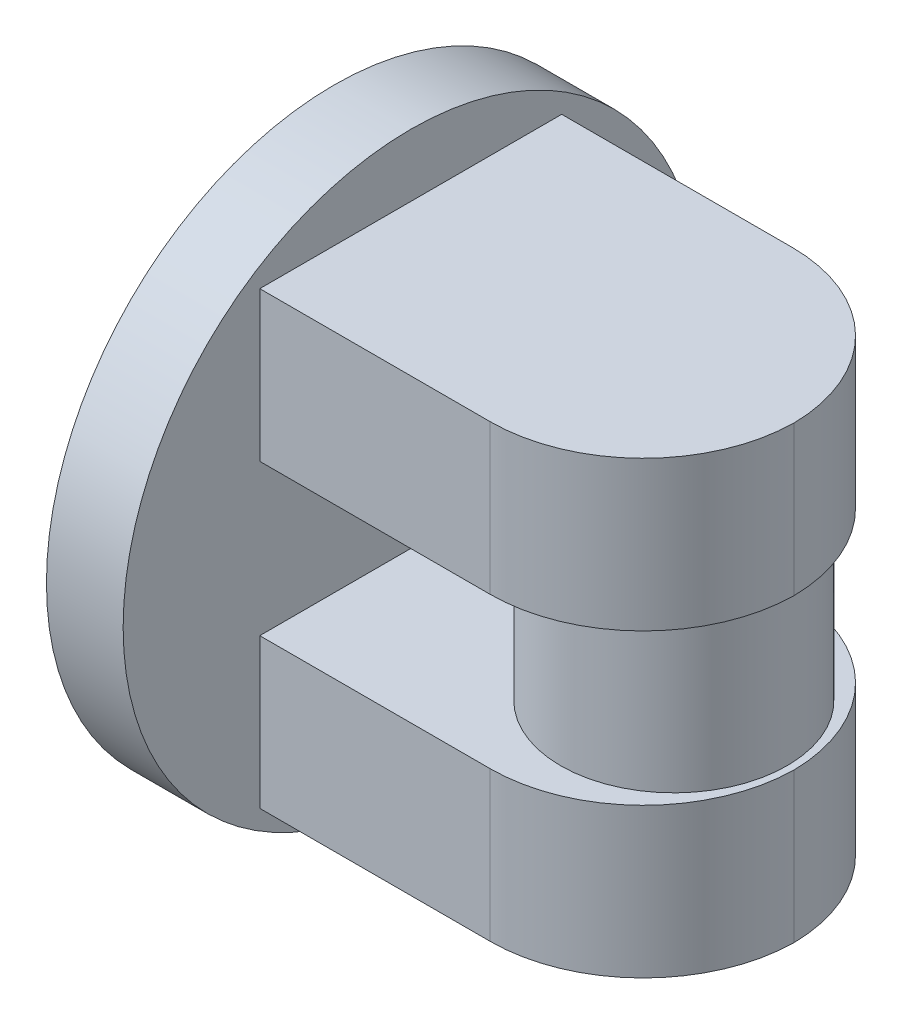
ISO-10303-21;
HEADER;
FILE_DESCRIPTION(('STEP AP214'),'2;1');
FILE_NAME('part.step','',(''),(''),'','','');
FILE_SCHEMA(('AUTOMOTIVE_DESIGN { 1 0 10303 214 1 1 1 1 }'));
ENDSEC;
DATA;
#1=APPLICATION_CONTEXT('core data for automotive mechanical design processes');
#2=APPLICATION_PROTOCOL_DEFINITION('international standard','automotive_design',2000,#1);
#3=PRODUCT_CONTEXT('',#1,'mechanical');
#4=PRODUCT('Part','Part','',(#3));
#5=PRODUCT_RELATED_PRODUCT_CATEGORY('part','',(#4));
#6=PRODUCT_DEFINITION_FORMATION('','',#4);
#7=PRODUCT_DEFINITION_CONTEXT('part definition',#1,'design');
#8=PRODUCT_DEFINITION('design','',#6,#7);
#9=PRODUCT_DEFINITION_SHAPE('','',#8);
#10=(LENGTH_UNIT() NAMED_UNIT(*) SI_UNIT(.MILLI.,.METRE.));
#11=(NAMED_UNIT(*) PLANE_ANGLE_UNIT() SI_UNIT($,.RADIAN.));
#12=(NAMED_UNIT(*) SI_UNIT($,.STERADIAN.) SOLID_ANGLE_UNIT());
#13=UNCERTAINTY_MEASURE_WITH_UNIT(LENGTH_MEASURE(1.E-05),#10,'distance_accuracy_value','');
#14=(GEOMETRIC_REPRESENTATION_CONTEXT(3) GLOBAL_UNCERTAINTY_ASSIGNED_CONTEXT((#13)) GLOBAL_UNIT_ASSIGNED_CONTEXT((#10,
#11,#12)) REPRESENTATION_CONTEXT('',''));
#15=CARTESIAN_POINT('',(0.,0.,0.));
#16=DIRECTION('',(0.,0.,1.));
#17=DIRECTION('',(1.,0.,0.));
#18=AXIS2_PLACEMENT_3D('',#15,#16,#17);
#19=CARTESIAN_POINT('',(202.565,159.836148569031,-4.53847309349857));
#20=DIRECTION('',(1.,0.,0.));
#21=DIRECTION('',(0.,0.,-1.));
#22=AXIS2_PLACEMENT_3D('',#19,#20,#21);
#23=PLANE('',#22);
#24=DIRECTION('',(0.,-1.,0.));
#25=VECTOR('',#24,1.);
#26=CARTESIAN_POINT('',(202.565,0.,-14.5384730934986));
#27=LINE('',#26,#25);
#28=CARTESIAN_POINT('',(202.565,154.836148569031,-14.5384730934986));
#29=VERTEX_POINT('',#28);
#30=CARTESIAN_POINT('',(202.565,144.930148569031,-14.5384730934986));
#31=VERTEX_POINT('',#30);
#32=EDGE_CURVE('E171',#29,#31,#27,.T.);
#33=ORIENTED_EDGE('',*,*,#32,.T.);
#34=DIRECTION('',(0.,0.,-1.));
#35=VECTOR('',#34,1.);
#36=CARTESIAN_POINT('',(202.565,144.930148569031,0.));
#37=LINE('',#36,#35);
#38=CARTESIAN_POINT('',(202.565,144.930148569031,5.46152690650143));
#39=VERTEX_POINT('',#38);
#40=EDGE_CURVE('E184',#39,#31,#37,.T.);
#41=ORIENTED_EDGE('',*,*,#40,.F.);
#42=DIRECTION('',(0.,-1.,0.));
#43=VECTOR('',#42,1.);
#44=CARTESIAN_POINT('',(202.565,0.,5.46152690650141));
#45=LINE('',#44,#43);
#46=CARTESIAN_POINT('',(202.565,154.836148569031,5.46152690650143));
#47=VERTEX_POINT('',#46);
#48=EDGE_CURVE('E180',#47,#39,#45,.T.);
#49=ORIENTED_EDGE('',*,*,#48,.F.);
#50=DIRECTION('',(0.,0.,-1.));
#51=VECTOR('',#50,1.);
#52=CARTESIAN_POINT('',(202.565,154.836148569031,0.));
#53=LINE('',#52,#51);
#54=EDGE_CURVE('E175',#47,#29,#53,.T.);
#55=ORIENTED_EDGE('',*,*,#54,.T.);
#56=EDGE_LOOP('',(#33,#41,#49,#55));
#57=FACE_BOUND('',#56,.T.);
#58=CARTESIAN_POINT('',(202.565,159.836148569031,-4.53847309349857));
#59=DIRECTION('',(1.,0.,0.));
#60=DIRECTION('',(0.,0.,-1.));
#61=AXIS2_PLACEMENT_3D('',#58,#59,#60);
#62=CIRCLE('',#61,19.05);
#63=CARTESIAN_POINT('',(202.565,159.836148569031,-23.5884730934986));
#64=VERTEX_POINT('',#63);
#65=EDGE_CURVE('E199',#64,#64,#62,.T.);
#66=ORIENTED_EDGE('',*,*,#65,.T.);
#67=EDGE_LOOP('',(#66));
#68=FACE_BOUND('',#67,.T.);
#69=DIRECTION('',(0.,1.,0.));
#70=VECTOR('',#69,1.);
#71=CARTESIAN_POINT('',(202.565,0.,-14.5384730934986));
#72=LINE('',#71,#70);
#73=CARTESIAN_POINT('',(202.565,164.836148569031,-14.5384730934986));
#74=VERTEX_POINT('',#73);
#75=CARTESIAN_POINT('',(202.565,174.742148569031,-14.5384730934986));
#76=VERTEX_POINT('',#75);
#77=EDGE_CURVE('E149',#74,#76,#72,.T.);
#78=ORIENTED_EDGE('',*,*,#77,.F.);
#79=DIRECTION('',(0.,0.,-1.));
#80=VECTOR('',#79,1.);
#81=CARTESIAN_POINT('',(202.565,164.836148569031,0.));
#82=LINE('',#81,#80);
#83=CARTESIAN_POINT('',(202.565,164.836148569031,5.46152690650143));
#84=VERTEX_POINT('',#83);
#85=EDGE_CURVE('E132',#84,#74,#82,.T.);
#86=ORIENTED_EDGE('',*,*,#85,.F.);
#87=DIRECTION('',(0.,1.,0.));
#88=VECTOR('',#87,1.);
#89=CARTESIAN_POINT('',(202.565,0.,5.46152690650143));
#90=LINE('',#89,#88);
#91=CARTESIAN_POINT('',(202.565,174.742148569031,5.46152690650143));
#92=VERTEX_POINT('',#91);
#93=EDGE_CURVE('E141',#84,#92,#90,.T.);
#94=ORIENTED_EDGE('',*,*,#93,.T.);
#95=DIRECTION('',(0.,0.,-1.));
#96=VECTOR('',#95,1.);
#97=CARTESIAN_POINT('',(202.565,174.742148569031,0.));
#98=LINE('',#97,#96);
#99=EDGE_CURVE('E156',#92,#76,#98,.T.);
#100=ORIENTED_EDGE('',*,*,#99,.T.);
#101=EDGE_LOOP('',(#78,#86,#94,#100));
#102=FACE_BOUND('',#101,.T.);
#103=ADVANCED_FACE('F51',(#57,#68,#102),#23,.T.);
#104=CARTESIAN_POINT('',(202.565,159.836148569031,-4.53847309349857));
#105=DIRECTION('',(-1.,0.,0.));
#106=DIRECTION('',(0.,0.,1.));
#107=AXIS2_PLACEMENT_3D('',#104,#105,#106);
#108=CYLINDRICAL_SURFACE('',#107,19.05);
#109=ORIENTED_EDGE('',*,*,#65,.F.);
#110=EDGE_LOOP('',(#109));
#111=FACE_BOUND('',#110,.T.);
#112=CARTESIAN_POINT('',(197.485,159.836148569031,-4.53847309349857));
#113=DIRECTION('',(1.,0.,0.));
#114=DIRECTION('',(0.,0.,-1.));
#115=AXIS2_PLACEMENT_3D('',#112,#113,#114);
#116=CIRCLE('',#115,19.05);
#117=CARTESIAN_POINT('',(197.485,159.836148569031,-23.5884730934986));
#118=VERTEX_POINT('',#117);
#119=EDGE_CURVE('E170',#118,#118,#116,.T.);
#120=ORIENTED_EDGE('',*,*,#119,.T.);
#121=EDGE_LOOP('',(#120));
#122=FACE_BOUND('',#121,.T.);
#123=ADVANCED_FACE('F279',(#111,#122),#108,.T.);
#124=CARTESIAN_POINT('',(197.485,159.836148569031,-4.53847309349857));
#125=DIRECTION('',(1.,0.,0.));
#126=DIRECTION('',(0.,0.,-1.));
#127=AXIS2_PLACEMENT_3D('',#124,#125,#126);
#128=PLANE('',#127);
#129=ORIENTED_EDGE('',*,*,#119,.F.);
#130=EDGE_LOOP('',(#129));
#131=FACE_BOUND('',#130,.T.);
#132=ADVANCED_FACE('F284',(#131),#128,.F.);
#133=CARTESIAN_POINT('',(227.965,0.,-14.5384730934986));
#134=DIRECTION('',(0.,0.,-1.));
#135=DIRECTION('',(0.,1.,0.));
#136=AXIS2_PLACEMENT_3D('',#133,#134,#135);
#137=PLANE('',#136);
#138=DIRECTION('',(-1.,0.,0.));
#139=VECTOR('',#138,1.);
#140=CARTESIAN_POINT('',(227.965,154.836148569031,-14.5384730934986));
#141=LINE('',#140,#139);
#142=CARTESIAN_POINT('',(217.8304,154.836148569031,-14.5384730934986));
#143=VERTEX_POINT('',#142);
#144=EDGE_CURVE('E151',#143,#29,#141,.T.);
#145=ORIENTED_EDGE('',*,*,#144,.F.);
#146=DIRECTION('',(0.,-1.,0.));
#147=VECTOR('',#146,1.);
#148=CARTESIAN_POINT('',(217.8304,0.,-14.5384730934986));
#149=LINE('',#148,#147);
#150=CARTESIAN_POINT('',(217.8304,144.930148569031,-14.5384730934986));
#151=VERTEX_POINT('',#150);
#152=EDGE_CURVE('E61',#143,#151,#149,.T.);
#153=ORIENTED_EDGE('',*,*,#152,.T.);
#154=DIRECTION('',(-1.,0.,0.));
#155=VECTOR('',#154,1.);
#156=CARTESIAN_POINT('',(227.965,144.930148569031,-14.5384730934986));
#157=LINE('',#156,#155);
#158=EDGE_CURVE('E188',#151,#31,#157,.T.);
#159=ORIENTED_EDGE('',*,*,#158,.T.);
#160=ORIENTED_EDGE('',*,*,#32,.F.);
#161=EDGE_LOOP('',(#145,#153,#159,#160));
#162=FACE_BOUND('',#161,.T.);
#163=ADVANCED_FACE('F256',(#162),#137,.T.);
#164=CARTESIAN_POINT('',(227.965,154.836148569031,0.));
#165=DIRECTION('',(0.,1.,0.));
#166=DIRECTION('',(0.,0.,1.));
#167=AXIS2_PLACEMENT_3D('',#164,#165,#166);
#168=PLANE('',#167);
#169=CARTESIAN_POINT('',(219.993733330726,154.836148569031,-4.53847309349858));
#170=DIRECTION('',(0.,1.,0.));
#171=DIRECTION('',(0.,0.,1.));
#172=AXIS2_PLACEMENT_3D('',#169,#170,#171);
#173=CIRCLE('',#172,7.50000000000001);
#174=CARTESIAN_POINT('',(219.993733330726,154.836148569031,2.96152690650144));
#175=VERTEX_POINT('',#174);
#176=EDGE_CURVE('E203',#175,#175,#173,.T.);
#177=ORIENTED_EDGE('',*,*,#176,.F.);
#178=EDGE_LOOP('',(#177));
#179=FACE_BOUND('',#178,.T.);
#180=DIRECTION('',(-1.,0.,0.));
#181=VECTOR('',#180,1.);
#182=CARTESIAN_POINT('',(227.965,154.836148569031,5.46152690650143));
#183=LINE('',#182,#181);
#184=CARTESIAN_POINT('',(217.8304,154.836148569031,5.46152690650143));
#185=VERTEX_POINT('',#184);
#186=EDGE_CURVE('E194',#185,#47,#183,.T.);
#187=ORIENTED_EDGE('',*,*,#186,.F.);
#188=CARTESIAN_POINT('',(217.8304,154.836148569031,-4.67307309349857));
#189=DIRECTION('',(0.,1.,0.));
#190=DIRECTION('',(0.,0.,1.));
#191=AXIS2_PLACEMENT_3D('',#188,#189,#190);
#192=CIRCLE('',#191,10.1346);
#193=CARTESIAN_POINT('',(227.964106133493,154.836148569031,-4.53847309349857));
#194=VERTEX_POINT('',#193);
#195=EDGE_CURVE('E69',#185,#194,#192,.T.);
#196=ORIENTED_EDGE('',*,*,#195,.T.);
#197=CARTESIAN_POINT('',(217.8304,154.836148569031,-4.40387309349857));
#198=DIRECTION('',(0.,1.,0.));
#199=DIRECTION('',(0.,0.,1.));
#200=AXIS2_PLACEMENT_3D('',#197,#198,#199);
#201=CIRCLE('',#200,10.1346);
#202=EDGE_CURVE('E73',#194,#143,#201,.T.);
#203=ORIENTED_EDGE('',*,*,#202,.T.);
#204=ORIENTED_EDGE('',*,*,#144,.T.);
#205=ORIENTED_EDGE('',*,*,#54,.F.);
#206=EDGE_LOOP('',(#187,#196,#203,#204,#205));
#207=FACE_BOUND('',#206,.T.);
#208=ADVANCED_FACE('F266',(#179,#207),#168,.T.);
#209=CARTESIAN_POINT('',(227.965,0.,5.46152690650141));
#210=DIRECTION('',(0.,0.,-1.));
#211=DIRECTION('',(0.,1.,0.));
#212=AXIS2_PLACEMENT_3D('',#209,#210,#211);
#213=PLANE('',#212);
#214=DIRECTION('',(-1.,0.,0.));
#215=VECTOR('',#214,1.);
#216=CARTESIAN_POINT('',(227.965,144.930148569031,5.46152690650143));
#217=LINE('',#216,#215);
#218=CARTESIAN_POINT('',(217.8304,144.930148569031,5.46152690650143));
#219=VERTEX_POINT('',#218);
#220=EDGE_CURVE('E191',#219,#39,#217,.T.);
#221=ORIENTED_EDGE('',*,*,#220,.F.);
#222=DIRECTION('',(0.,-1.,0.));
#223=VECTOR('',#222,1.);
#224=CARTESIAN_POINT('',(217.8304,154.836148569031,5.46152690650143));
#225=LINE('',#224,#223);
#226=EDGE_CURVE('E227',#219,#185,#225,.F.);
#227=ORIENTED_EDGE('',*,*,#226,.T.);
#228=ORIENTED_EDGE('',*,*,#186,.T.);
#229=ORIENTED_EDGE('',*,*,#48,.T.);
#230=EDGE_LOOP('',(#221,#227,#228,#229));
#231=FACE_BOUND('',#230,.T.);
#232=ADVANCED_FACE('F268',(#231),#213,.F.);
#233=CARTESIAN_POINT('',(227.965,144.930148569031,0.));
#234=DIRECTION('',(0.,1.,0.));
#235=DIRECTION('',(0.,0.,1.));
#236=AXIS2_PLACEMENT_3D('',#233,#234,#235);
#237=PLANE('',#236);
#238=CARTESIAN_POINT('',(217.8304,144.930148569031,-4.40387309349858));
#239=DIRECTION('',(0.,1.,0.));
#240=DIRECTION('',(0.,0.,1.));
#241=AXIS2_PLACEMENT_3D('',#238,#239,#240);
#242=CIRCLE('',#241,10.1346);
#243=CARTESIAN_POINT('',(227.964106133493,144.930148569031,-4.53847309349857));
#244=VERTEX_POINT('',#243);
#245=EDGE_CURVE('E221',#151,#244,#242,.F.);
#246=ORIENTED_EDGE('',*,*,#245,.T.);
#247=CARTESIAN_POINT('',(217.8304,144.930148569031,-4.67307309349857));
#248=DIRECTION('',(0.,1.,0.));
#249=DIRECTION('',(0.,0.,1.));
#250=AXIS2_PLACEMENT_3D('',#247,#248,#249);
#251=CIRCLE('',#250,10.1346);
#252=EDGE_CURVE('E224',#244,#219,#251,.F.);
#253=ORIENTED_EDGE('',*,*,#252,.T.);
#254=ORIENTED_EDGE('',*,*,#220,.T.);
#255=ORIENTED_EDGE('',*,*,#40,.T.);
#256=ORIENTED_EDGE('',*,*,#158,.F.);
#257=EDGE_LOOP('',(#246,#253,#254,#255,#256));
#258=FACE_BOUND('',#257,.T.);
#259=ADVANCED_FACE('F259',(#258),#237,.F.);
#260=CARTESIAN_POINT('',(227.965,164.836148569031,0.));
#261=DIRECTION('',(0.,1.,0.));
#262=DIRECTION('',(0.,0.,1.));
#263=AXIS2_PLACEMENT_3D('',#260,#261,#262);
#264=PLANE('',#263);
#265=CARTESIAN_POINT('',(219.993733330726,164.836148569031,-4.53847309349858));
#266=DIRECTION('',(0.,1.,0.));
#267=DIRECTION('',(0.,0.,1.));
#268=AXIS2_PLACEMENT_3D('',#265,#266,#267);
#269=CIRCLE('',#268,7.50000000000001);
#270=CARTESIAN_POINT('',(219.993733330726,164.836148569031,2.96152690650144));
#271=VERTEX_POINT('',#270);
#272=EDGE_CURVE('E176',#271,#271,#269,.T.);
#273=ORIENTED_EDGE('',*,*,#272,.T.);
#274=EDGE_LOOP('',(#273));
#275=FACE_BOUND('',#274,.T.);
#276=CARTESIAN_POINT('',(217.8304,164.836148569031,-4.40387309349857));
#277=DIRECTION('',(0.,1.,0.));
#278=DIRECTION('',(0.,0.,1.));
#279=AXIS2_PLACEMENT_3D('',#276,#277,#278);
#280=CIRCLE('',#279,10.1346);
#281=CARTESIAN_POINT('',(217.8304,164.836148569031,-14.5384730934986));
#282=VERTEX_POINT('',#281);
#283=CARTESIAN_POINT('',(227.964106133493,164.836148569031,-4.53847309349857));
#284=VERTEX_POINT('',#283);
#285=EDGE_CURVE('E216',#282,#284,#280,.F.);
#286=ORIENTED_EDGE('',*,*,#285,.T.);
#287=CARTESIAN_POINT('',(217.8304,164.836148569031,-4.67307309349857));
#288=DIRECTION('',(0.,1.,0.));
#289=DIRECTION('',(0.,0.,1.));
#290=AXIS2_PLACEMENT_3D('',#287,#288,#289);
#291=CIRCLE('',#290,10.1346);
#292=CARTESIAN_POINT('',(217.8304,164.836148569031,5.46152690650143));
#293=VERTEX_POINT('',#292);
#294=EDGE_CURVE('E134',#284,#293,#291,.F.);
#295=ORIENTED_EDGE('',*,*,#294,.T.);
#296=DIRECTION('',(-1.,0.,0.));
#297=VECTOR('',#296,1.);
#298=CARTESIAN_POINT('',(227.965,164.836148569031,5.46152690650143));
#299=LINE('',#298,#297);
#300=EDGE_CURVE('E128',#293,#84,#299,.T.);
#301=ORIENTED_EDGE('',*,*,#300,.T.);
#302=ORIENTED_EDGE('',*,*,#85,.T.);
#303=DIRECTION('',(-1.,0.,0.));
#304=VECTOR('',#303,1.);
#305=CARTESIAN_POINT('',(227.965,164.836148569031,-14.5384730934986));
#306=LINE('',#305,#304);
#307=EDGE_CURVE('E167',#282,#74,#306,.T.);
#308=ORIENTED_EDGE('',*,*,#307,.F.);
#309=EDGE_LOOP('',(#286,#295,#301,#302,#308));
#310=FACE_BOUND('',#309,.T.);
#311=ADVANCED_FACE('F130',(#275,#310),#264,.F.);
#312=CARTESIAN_POINT('',(227.965,0.,-14.5384730934986));
#313=DIRECTION('',(0.,0.,1.));
#314=DIRECTION('',(1.,0.,0.));
#315=AXIS2_PLACEMENT_3D('',#312,#313,#314);
#316=PLANE('',#315);
#317=DIRECTION('',(-1.,0.,0.));
#318=VECTOR('',#317,1.);
#319=CARTESIAN_POINT('',(227.965,174.742148569031,-14.5384730934986));
#320=LINE('',#319,#318);
#321=CARTESIAN_POINT('',(217.8304,174.742148569031,-14.5384730934986));
#322=VERTEX_POINT('',#321);
#323=EDGE_CURVE('E164',#322,#76,#320,.T.);
#324=ORIENTED_EDGE('',*,*,#323,.F.);
#325=DIRECTION('',(0.,1.,0.));
#326=VECTOR('',#325,1.);
#327=CARTESIAN_POINT('',(217.8304,164.836148569031,-14.5384730934986));
#328=LINE('',#327,#326);
#329=EDGE_CURVE('E11',#322,#282,#328,.F.);
#330=ORIENTED_EDGE('',*,*,#329,.T.);
#331=ORIENTED_EDGE('',*,*,#307,.T.);
#332=ORIENTED_EDGE('',*,*,#77,.T.);
#333=EDGE_LOOP('',(#324,#330,#331,#332));
#334=FACE_BOUND('',#333,.T.);
#335=ADVANCED_FACE('F333',(#334),#316,.F.);
#336=CARTESIAN_POINT('',(227.965,174.742148569031,0.));
#337=DIRECTION('',(0.,1.,0.));
#338=DIRECTION('',(0.,0.,1.));
#339=AXIS2_PLACEMENT_3D('',#336,#337,#338);
#340=PLANE('',#339);
#341=DIRECTION('',(-1.,0.,0.));
#342=VECTOR('',#341,1.);
#343=CARTESIAN_POINT('',(227.965,174.742148569031,5.46152690650143));
#344=LINE('',#343,#342);
#345=CARTESIAN_POINT('',(217.8304,174.742148569031,5.46152690650143));
#346=VERTEX_POINT('',#345);
#347=EDGE_CURVE('E140',#346,#92,#344,.T.);
#348=ORIENTED_EDGE('',*,*,#347,.F.);
#349=CARTESIAN_POINT('',(217.8304,174.742148569031,-4.67307309349857));
#350=DIRECTION('',(0.,1.,0.));
#351=DIRECTION('',(0.,0.,1.));
#352=AXIS2_PLACEMENT_3D('',#349,#350,#351);
#353=CIRCLE('',#352,10.1346);
#354=CARTESIAN_POINT('',(227.964106133493,174.742148569031,-4.53847309349857));
#355=VERTEX_POINT('',#354);
#356=EDGE_CURVE('E213',#346,#355,#353,.T.);
#357=ORIENTED_EDGE('',*,*,#356,.T.);
#358=CARTESIAN_POINT('',(217.8304,174.742148569031,-4.40387309349857));
#359=DIRECTION('',(0.,1.,0.));
#360=DIRECTION('',(0.,0.,1.));
#361=AXIS2_PLACEMENT_3D('',#358,#359,#360);
#362=CIRCLE('',#361,10.1346);
#363=EDGE_CURVE('E210',#355,#322,#362,.T.);
#364=ORIENTED_EDGE('',*,*,#363,.T.);
#365=ORIENTED_EDGE('',*,*,#323,.T.);
#366=ORIENTED_EDGE('',*,*,#99,.F.);
#367=EDGE_LOOP('',(#348,#357,#364,#365,#366));
#368=FACE_BOUND('',#367,.T.);
#369=ADVANCED_FACE('F326',(#368),#340,.T.);
#370=CARTESIAN_POINT('',(227.965,0.,5.46152690650143));
#371=DIRECTION('',(0.,0.,1.));
#372=DIRECTION('',(1.,0.,0.));
#373=AXIS2_PLACEMENT_3D('',#370,#371,#372);
#374=PLANE('',#373);
#375=ORIENTED_EDGE('',*,*,#300,.F.);
#376=DIRECTION('',(0.,1.,0.));
#377=VECTOR('',#376,1.);
#378=CARTESIAN_POINT('',(217.8304,0.,5.46152690650143));
#379=LINE('',#378,#377);
#380=EDGE_CURVE('E207',#293,#346,#379,.T.);
#381=ORIENTED_EDGE('',*,*,#380,.T.);
#382=ORIENTED_EDGE('',*,*,#347,.T.);
#383=ORIENTED_EDGE('',*,*,#93,.F.);
#384=EDGE_LOOP('',(#375,#381,#382,#383));
#385=FACE_BOUND('',#384,.T.);
#386=ADVANCED_FACE('F153',(#385),#374,.T.);
#387=CARTESIAN_POINT('',(219.993733330726,195.955352004628,-4.53847309349858));
#388=DIRECTION('',(0.,-1.,0.));
#389=DIRECTION('',(0.,0.,-1.));
#390=AXIS2_PLACEMENT_3D('',#387,#388,#389);
#391=CYLINDRICAL_SURFACE('',#390,7.50000000000001);
#392=ORIENTED_EDGE('',*,*,#176,.T.);
#393=EDGE_LOOP('',(#392));
#394=FACE_BOUND('',#393,.T.);
#395=ORIENTED_EDGE('',*,*,#272,.F.);
#396=EDGE_LOOP('',(#395));
#397=FACE_BOUND('',#396,.T.);
#398=ADVANCED_FACE('F297',(#394,#397),#391,.T.);
#399=CARTESIAN_POINT('',(217.8304,0.,-4.40387309349857));
#400=DIRECTION('',(0.,-1.,0.));
#401=DIRECTION('',(0.,0.,-1.));
#402=AXIS2_PLACEMENT_3D('',#399,#400,#401);
#403=CYLINDRICAL_SURFACE('',#402,10.1346);
#404=DIRECTION('',(0.,-1.,0.));
#405=VECTOR('',#404,1.);
#406=CARTESIAN_POINT('',(227.964106133493,169.789148569031,-4.53847309349857));
#407=LINE('',#406,#405);
#408=EDGE_CURVE('E236',#284,#355,#407,.F.);
#409=ORIENTED_EDGE('',*,*,#408,.F.);
#410=ORIENTED_EDGE('',*,*,#285,.F.);
#411=ORIENTED_EDGE('',*,*,#329,.F.);
#412=ORIENTED_EDGE('',*,*,#363,.F.);
#413=EDGE_LOOP('',(#409,#410,#411,#412));
#414=FACE_BOUND('',#413,.T.);
#415=ADVANCED_FACE('F295',(#414),#403,.T.);
#416=CARTESIAN_POINT('',(217.8304,0.,-4.67307309349857));
#417=DIRECTION('',(0.,1.,0.));
#418=DIRECTION('',(0.,0.,1.));
#419=AXIS2_PLACEMENT_3D('',#416,#417,#418);
#420=CYLINDRICAL_SURFACE('',#419,10.1346);
#421=ORIENTED_EDGE('',*,*,#294,.F.);
#422=ORIENTED_EDGE('',*,*,#408,.T.);
#423=ORIENTED_EDGE('',*,*,#356,.F.);
#424=ORIENTED_EDGE('',*,*,#380,.F.);
#425=EDGE_LOOP('',(#421,#422,#423,#424));
#426=FACE_BOUND('',#425,.T.);
#427=ADVANCED_FACE('F292',(#426),#420,.T.);
#428=CARTESIAN_POINT('',(217.8304,0.,-4.40387309349863));
#429=DIRECTION('',(0.,-1.,0.));
#430=DIRECTION('',(0.,0.,-1.));
#431=AXIS2_PLACEMENT_3D('',#428,#429,#430);
#432=CYLINDRICAL_SURFACE('',#431,10.1346);
#433=ORIENTED_EDGE('',*,*,#152,.F.);
#434=ORIENTED_EDGE('',*,*,#202,.F.);
#435=DIRECTION('',(0.,-1.,0.));
#436=VECTOR('',#435,1.);
#437=CARTESIAN_POINT('',(227.964106133493,149.883148569031,-4.53847309349857));
#438=LINE('',#437,#436);
#439=EDGE_CURVE('E55',#244,#194,#438,.F.);
#440=ORIENTED_EDGE('',*,*,#439,.F.);
#441=ORIENTED_EDGE('',*,*,#245,.F.);
#442=EDGE_LOOP('',(#433,#434,#440,#441));
#443=FACE_BOUND('',#442,.T.);
#444=ADVANCED_FACE('F53',(#443),#432,.T.);
#445=CARTESIAN_POINT('',(217.8304,0.,-4.67307309349859));
#446=DIRECTION('',(0.,1.,0.));
#447=DIRECTION('',(0.,0.,1.));
#448=AXIS2_PLACEMENT_3D('',#445,#446,#447);
#449=CYLINDRICAL_SURFACE('',#448,10.1346);
#450=ORIENTED_EDGE('',*,*,#195,.F.);
#451=ORIENTED_EDGE('',*,*,#226,.F.);
#452=ORIENTED_EDGE('',*,*,#252,.F.);
#453=ORIENTED_EDGE('',*,*,#439,.T.);
#454=EDGE_LOOP('',(#450,#451,#452,#453));
#455=FACE_BOUND('',#454,.T.);
#456=ADVANCED_FACE('F249',(#455),#449,.T.);
#457=CLOSED_SHELL('',(#103,#123,#132,#163,#208,#232,#259,#311,#335,#369,#386,#398,#415,#427,
#444,#456));
#458=MANIFOLD_SOLID_BREP('B2',#457);
#459=ADVANCED_BREP_SHAPE_REPRESENTATION('',(#18,#458),#14);
#460=SHAPE_DEFINITION_REPRESENTATION(#9,#459);
ENDSEC;
END-ISO-10303-21;
